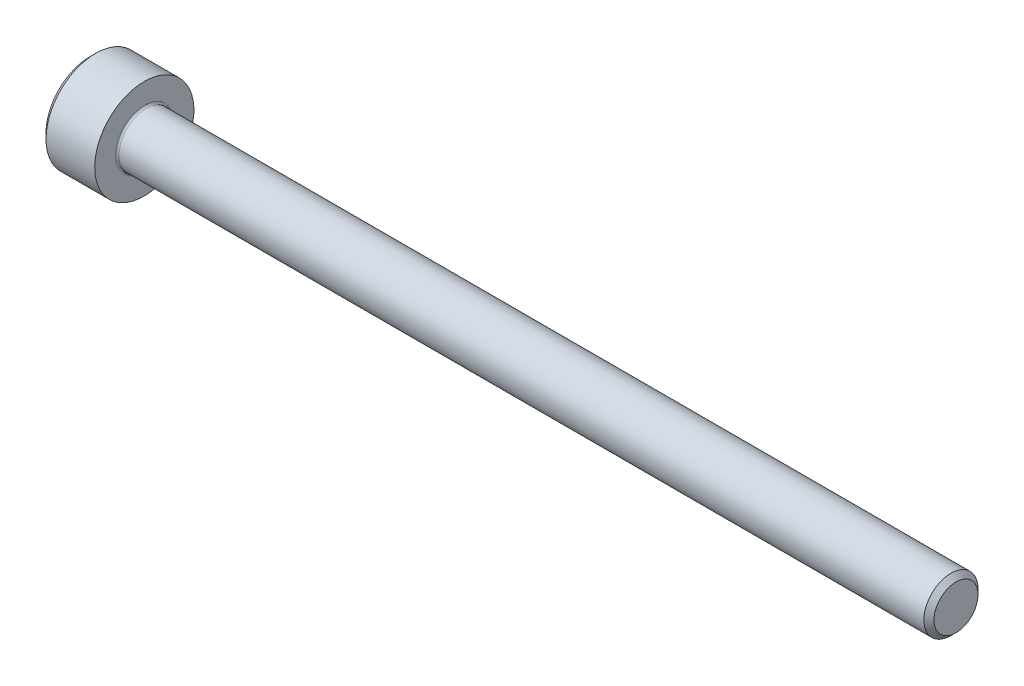
ISO-10303-21;
HEADER;
FILE_DESCRIPTION(('STEP AP214'),'2;1');
FILE_NAME('part.step','',(''),(''),'','','');
FILE_SCHEMA(('AUTOMOTIVE_DESIGN { 1 0 10303 214 1 1 1 1 }'));
ENDSEC;
DATA;
#1=APPLICATION_CONTEXT('core data for automotive mechanical design processes');
#2=APPLICATION_PROTOCOL_DEFINITION('international standard','automotive_design',2000,#1);
#3=PRODUCT_CONTEXT('',#1,'mechanical');
#4=PRODUCT('Part','Part','',(#3));
#5=PRODUCT_RELATED_PRODUCT_CATEGORY('part','',(#4));
#6=PRODUCT_DEFINITION_FORMATION('','',#4);
#7=PRODUCT_DEFINITION_CONTEXT('part definition',#1,'design');
#8=PRODUCT_DEFINITION('design','',#6,#7);
#9=PRODUCT_DEFINITION_SHAPE('','',#8);
#10=(LENGTH_UNIT() NAMED_UNIT(*) SI_UNIT(.MILLI.,.METRE.));
#11=(NAMED_UNIT(*) PLANE_ANGLE_UNIT() SI_UNIT($,.RADIAN.));
#12=(NAMED_UNIT(*) SI_UNIT($,.STERADIAN.) SOLID_ANGLE_UNIT());
#13=UNCERTAINTY_MEASURE_WITH_UNIT(LENGTH_MEASURE(1.E-05),#10,'distance_accuracy_value','');
#14=(GEOMETRIC_REPRESENTATION_CONTEXT(3) GLOBAL_UNCERTAINTY_ASSIGNED_CONTEXT((#13)) GLOBAL_UNIT_ASSIGNED_CONTEXT((#10,
#11,#12)) REPRESENTATION_CONTEXT('',''));
#15=CARTESIAN_POINT('',(0.,0.,0.));
#16=DIRECTION('',(0.,0.,1.));
#17=DIRECTION('',(1.,0.,0.));
#18=AXIS2_PLACEMENT_3D('',#15,#16,#17);
#19=CARTESIAN_POINT('',(0.,0.,0.));
#20=DIRECTION('',(-1.,0.,0.));
#21=DIRECTION('',(0.,0.,1.));
#22=AXIS2_PLACEMENT_3D('',#19,#20,#21);
#23=PLANE('',#22);
#24=DIRECTION('',(0.,-0.499999999999999,0.866025403784439));
#25=VECTOR('',#24,1.);
#26=CARTESIAN_POINT('',(0.,1.47801668912544,0.));
#27=LINE('',#26,#25);
#28=CARTESIAN_POINT('',(0.,1.47801668912544,0.));
#29=VERTEX_POINT('',#28);
#30=CARTESIAN_POINT('',(0.,0.739008344562724,1.28));
#31=VERTEX_POINT('',#30);
#32=EDGE_CURVE('E288',#29,#31,#27,.T.);
#33=ORIENTED_EDGE('',*,*,#32,.T.);
#34=DIRECTION('',(0.,1.,0.));
#35=VECTOR('',#34,1.);
#36=CARTESIAN_POINT('',(0.,-0.739008344562718,1.28));
#37=LINE('',#36,#35);
#38=CARTESIAN_POINT('',(0.,-0.739008344562718,1.28));
#39=VERTEX_POINT('',#38);
#40=EDGE_CURVE('E141',#39,#31,#37,.T.);
#41=ORIENTED_EDGE('',*,*,#40,.F.);
#42=DIRECTION('',(0.,-0.500000000000001,-0.866025403784438));
#43=VECTOR('',#42,1.);
#44=CARTESIAN_POINT('',(0.,-0.739008344562718,1.28));
#45=LINE('',#44,#43);
#46=CARTESIAN_POINT('',(0.,-1.47801668912544,0.));
#47=VERTEX_POINT('',#46);
#48=EDGE_CURVE('E293',#39,#47,#45,.T.);
#49=ORIENTED_EDGE('',*,*,#48,.T.);
#50=DIRECTION('',(0.,0.499999999999998,-0.866025403784439));
#51=VECTOR('',#50,1.);
#52=CARTESIAN_POINT('',(0.,-1.47801668912544,0.));
#53=LINE('',#52,#51);
#54=CARTESIAN_POINT('',(0.,-0.739008344562722,-1.28));
#55=VERTEX_POINT('',#54);
#56=EDGE_CURVE('E297',#47,#55,#53,.T.);
#57=ORIENTED_EDGE('',*,*,#56,.T.);
#58=DIRECTION('',(0.,-1.,0.));
#59=VECTOR('',#58,1.);
#60=CARTESIAN_POINT('',(0.,0.73900834456272,-1.28));
#61=LINE('',#60,#59);
#62=CARTESIAN_POINT('',(0.,0.73900834456272,-1.28));
#63=VERTEX_POINT('',#62);
#64=EDGE_CURVE('E301',#63,#55,#61,.T.);
#65=ORIENTED_EDGE('',*,*,#64,.F.);
#66=DIRECTION('',(0.,-0.500000000000001,-0.866025403784438));
#67=VECTOR('',#66,1.);
#68=CARTESIAN_POINT('',(0.,1.47801668912544,0.));
#69=LINE('',#68,#67);
#70=EDGE_CURVE('E136',#29,#63,#69,.T.);
#71=ORIENTED_EDGE('',*,*,#70,.F.);
#72=EDGE_LOOP('',(#33,#41,#49,#57,#65,#71));
#73=FACE_BOUND('',#72,.T.);
#74=CARTESIAN_POINT('',(0.,0.,0.));
#75=DIRECTION('',(-1.,0.,0.));
#76=DIRECTION('',(0.,0.,1.));
#77=AXIS2_PLACEMENT_3D('',#74,#75,#76);
#78=CIRCLE('',#77,2.45);
#79=CARTESIAN_POINT('',(0.,0.,2.45));
#80=VERTEX_POINT('',#79);
#81=EDGE_CURVE('E174',#80,#80,#78,.T.);
#82=ORIENTED_EDGE('',*,*,#81,.T.);
#83=EDGE_LOOP('',(#82));
#84=FACE_BOUND('',#83,.T.);
#85=ADVANCED_FACE('F42',(#73,#84),#23,.T.);
#86=CARTESIAN_POINT('',(0.,0.,0.));
#87=DIRECTION('',(1.,0.,0.));
#88=DIRECTION('',(0.,0.,-1.));
#89=AXIS2_PLACEMENT_3D('',#86,#87,#88);
#90=CONICAL_SURFACE('',#89,2.45,0.785398163397443);
#91=CARTESIAN_POINT('',(0.300000000000002,0.,0.));
#92=DIRECTION('',(-1.,0.,0.));
#93=DIRECTION('',(0.,0.,1.));
#94=AXIS2_PLACEMENT_3D('',#91,#92,#93);
#95=CIRCLE('',#94,2.75);
#96=CARTESIAN_POINT('',(0.300000000000002,0.,2.75));
#97=VERTEX_POINT('',#96);
#98=EDGE_CURVE('E170',#97,#97,#95,.T.);
#99=ORIENTED_EDGE('',*,*,#98,.T.);
#100=EDGE_LOOP('',(#99));
#101=FACE_BOUND('',#100,.T.);
#102=ORIENTED_EDGE('',*,*,#81,.F.);
#103=EDGE_LOOP('',(#102));
#104=FACE_BOUND('',#103,.T.);
#105=ADVANCED_FACE('F198',(#101,#104),#90,.T.);
#106=CARTESIAN_POINT('',(-31.75,0.,0.));
#107=DIRECTION('',(-1.,0.,0.));
#108=DIRECTION('',(0.,0.,1.));
#109=AXIS2_PLACEMENT_3D('',#106,#107,#108);
#110=CYLINDRICAL_SURFACE('',#109,2.75);
#111=CARTESIAN_POINT('',(3.,0.,0.));
#112=DIRECTION('',(-1.,0.,0.));
#113=DIRECTION('',(0.,0.,1.));
#114=AXIS2_PLACEMENT_3D('',#111,#112,#113);
#115=CIRCLE('',#114,2.75);
#116=CARTESIAN_POINT('',(3.,0.,2.75));
#117=VERTEX_POINT('',#116);
#118=EDGE_CURVE('E166',#117,#117,#115,.T.);
#119=ORIENTED_EDGE('',*,*,#118,.T.);
#120=EDGE_LOOP('',(#119));
#121=FACE_BOUND('',#120,.T.);
#122=ORIENTED_EDGE('',*,*,#98,.F.);
#123=EDGE_LOOP('',(#122));
#124=FACE_BOUND('',#123,.T.);
#125=ADVANCED_FACE('F203',(#121,#124),#110,.T.);
#126=CARTESIAN_POINT('',(3.,2.75,0.));
#127=DIRECTION('',(1.,0.,0.));
#128=DIRECTION('',(0.,0.,-1.));
#129=AXIS2_PLACEMENT_3D('',#126,#127,#128);
#130=PLANE('',#129);
#131=CARTESIAN_POINT('',(3.,0.,0.));
#132=DIRECTION('',(1.,0.,0.));
#133=DIRECTION('',(0.,0.,-1.));
#134=AXIS2_PLACEMENT_3D('',#131,#132,#133);
#135=CIRCLE('',#134,1.6);
#136=CARTESIAN_POINT('',(3.,0.,-1.6));
#137=VERTEX_POINT('',#136);
#138=EDGE_CURVE('E51',#137,#137,#135,.F.);
#139=ORIENTED_EDGE('',*,*,#138,.T.);
#140=EDGE_LOOP('',(#139));
#141=FACE_BOUND('',#140,.T.);
#142=ORIENTED_EDGE('',*,*,#118,.F.);
#143=EDGE_LOOP('',(#142));
#144=FACE_BOUND('',#143,.T.);
#145=ADVANCED_FACE('F182',(#141,#144),#130,.T.);
#146=CARTESIAN_POINT('',(-31.75,0.,0.));
#147=DIRECTION('',(-1.,0.,0.));
#148=DIRECTION('',(0.,0.,1.));
#149=AXIS2_PLACEMENT_3D('',#146,#147,#148);
#150=CYLINDRICAL_SURFACE('',#149,1.5);
#151=CARTESIAN_POINT('',(3.1,0.,0.));
#152=DIRECTION('',(1.,0.,0.));
#153=DIRECTION('',(0.,0.,-1.));
#154=AXIS2_PLACEMENT_3D('',#151,#152,#153);
#155=CIRCLE('',#154,1.5);
#156=CARTESIAN_POINT('',(3.1,0.,-1.5));
#157=VERTEX_POINT('',#156);
#158=EDGE_CURVE('E11',#157,#157,#155,.T.);
#159=ORIENTED_EDGE('',*,*,#158,.T.);
#160=EDGE_LOOP('',(#159));
#161=FACE_BOUND('',#160,.T.);
#162=CARTESIAN_POINT('',(47.7195,0.,0.));
#163=DIRECTION('',(-1.,0.,0.));
#164=DIRECTION('',(0.,0.,1.));
#165=AXIS2_PLACEMENT_3D('',#162,#163,#164);
#166=CIRCLE('',#165,1.5);
#167=CARTESIAN_POINT('',(47.7195,0.,1.5));
#168=VERTEX_POINT('',#167);
#169=EDGE_CURVE('E162',#168,#168,#166,.T.);
#170=ORIENTED_EDGE('',*,*,#169,.T.);
#171=EDGE_LOOP('',(#170));
#172=FACE_BOUND('',#171,.T.);
#173=ADVANCED_FACE('F213',(#161,#172),#150,.T.);
#174=CARTESIAN_POINT('',(48.,0.,0.));
#175=DIRECTION('',(-1.,0.,0.));
#176=DIRECTION('',(0.,0.,1.));
#177=AXIS2_PLACEMENT_3D('',#174,#175,#176);
#178=CONICAL_SURFACE('',#177,1.2195,0.785398163397468);
#179=ORIENTED_EDGE('',*,*,#169,.F.);
#180=EDGE_LOOP('',(#179));
#181=FACE_BOUND('',#180,.T.);
#182=CARTESIAN_POINT('',(48.,0.,0.));
#183=DIRECTION('',(-1.,0.,0.));
#184=DIRECTION('',(0.,0.,1.));
#185=AXIS2_PLACEMENT_3D('',#182,#183,#184);
#186=CIRCLE('',#185,1.2195);
#187=CARTESIAN_POINT('',(48.,0.,1.2195));
#188=VERTEX_POINT('',#187);
#189=EDGE_CURVE('E157',#188,#188,#186,.T.);
#190=ORIENTED_EDGE('',*,*,#189,.T.);
#191=EDGE_LOOP('',(#190));
#192=FACE_BOUND('',#191,.T.);
#193=ADVANCED_FACE('F193',(#181,#192),#178,.T.);
#194=CARTESIAN_POINT('',(48.,1.2195,0.));
#195=DIRECTION('',(1.,0.,0.));
#196=DIRECTION('',(0.,0.,-1.));
#197=AXIS2_PLACEMENT_3D('',#194,#195,#196);
#198=PLANE('',#197);
#199=ORIENTED_EDGE('',*,*,#189,.F.);
#200=EDGE_LOOP('',(#199));
#201=FACE_BOUND('',#200,.T.);
#202=ADVANCED_FACE('F186',(#201),#198,.T.);
#203=CARTESIAN_POINT('',(3.1,0.,0.));
#204=DIRECTION('',(1.,0.,0.));
#205=DIRECTION('',(0.,0.,-1.));
#206=AXIS2_PLACEMENT_3D('',#203,#204,#205);
#207=TOROIDAL_SURFACE('',#206,1.6,0.1);
#208=ORIENTED_EDGE('',*,*,#158,.F.);
#209=EDGE_LOOP('',(#208));
#210=FACE_BOUND('',#209,.T.);
#211=ORIENTED_EDGE('',*,*,#138,.F.);
#212=EDGE_LOOP('',(#211));
#213=FACE_BOUND('',#212,.T.);
#214=ADVANCED_FACE('F44',(#210,#213),#207,.F.);
#215=CARTESIAN_POINT('',(1.3,1.47801668912544,0.));
#216=DIRECTION('',(0.,-0.866025403784439,-0.499999999999999));
#217=DIRECTION('',(0.,0.499999999999999,-0.866025403784439));
#218=AXIS2_PLACEMENT_3D('',#215,#216,#217);
#219=PLANE('',#218);
#220=ORIENTED_EDGE('',*,*,#32,.F.);
#221=DIRECTION('',(-1.,0.,0.));
#222=VECTOR('',#221,1.);
#223=CARTESIAN_POINT('',(1.3,1.47801668912544,0.));
#224=LINE('',#223,#222);
#225=CARTESIAN_POINT('',(1.3,1.47801668912544,0.));
#226=VERTEX_POINT('',#225);
#227=EDGE_CURVE('E274',#226,#29,#224,.T.);
#228=ORIENTED_EDGE('',*,*,#227,.F.);
#229=DIRECTION('',(0.,-0.499999999999999,0.866025403784439));
#230=VECTOR('',#229,1.);
#231=CARTESIAN_POINT('',(1.3,1.47801668912544,0.));
#232=LINE('',#231,#230);
#233=CARTESIAN_POINT('',(1.3,1.10851251684408,0.639999999999999));
#234=VERTEX_POINT('',#233);
#235=EDGE_CURVE('E127',#226,#234,#232,.T.);
#236=ORIENTED_EDGE('',*,*,#235,.T.);
#237=CARTESIAN_POINT('',(1.3,0.739008344562724,1.28));
#238=VERTEX_POINT('',#237);
#239=EDGE_CURVE('E117',#234,#238,#232,.T.);
#240=ORIENTED_EDGE('',*,*,#239,.T.);
#241=DIRECTION('',(-1.,0.,0.));
#242=VECTOR('',#241,1.);
#243=CARTESIAN_POINT('',(1.3,0.739008344562724,1.28));
#244=LINE('',#243,#242);
#245=EDGE_CURVE('E132',#238,#31,#244,.T.);
#246=ORIENTED_EDGE('',*,*,#245,.T.);
#247=EDGE_LOOP('',(#220,#228,#236,#240,#246));
#248=FACE_BOUND('',#247,.T.);
#249=ADVANCED_FACE('F131',(#248),#219,.T.);
#250=CARTESIAN_POINT('',(1.3,-0.739008344562718,1.28));
#251=DIRECTION('',(0.,0.,1.));
#252=DIRECTION('',(0.,-1.,0.));
#253=AXIS2_PLACEMENT_3D('',#250,#251,#252);
#254=PLANE('',#253);
#255=ORIENTED_EDGE('',*,*,#40,.T.);
#256=ORIENTED_EDGE('',*,*,#245,.F.);
#257=DIRECTION('',(0.,1.,0.));
#258=VECTOR('',#257,1.);
#259=CARTESIAN_POINT('',(1.3,-0.739008344562718,1.28));
#260=LINE('',#259,#258);
#261=CARTESIAN_POINT('',(1.3,0.,1.28));
#262=VERTEX_POINT('',#261);
#263=EDGE_CURVE('E114',#262,#238,#260,.T.);
#264=ORIENTED_EDGE('',*,*,#263,.F.);
#265=CARTESIAN_POINT('',(1.3,-0.739008344562718,1.28));
#266=VERTEX_POINT('',#265);
#267=EDGE_CURVE('E126',#266,#262,#260,.T.);
#268=ORIENTED_EDGE('',*,*,#267,.F.);
#269=DIRECTION('',(-1.,0.,0.));
#270=VECTOR('',#269,1.);
#271=CARTESIAN_POINT('',(1.3,-0.739008344562718,1.28));
#272=LINE('',#271,#270);
#273=EDGE_CURVE('E144',#266,#39,#272,.T.);
#274=ORIENTED_EDGE('',*,*,#273,.T.);
#275=EDGE_LOOP('',(#255,#256,#264,#268,#274));
#276=FACE_BOUND('',#275,.T.);
#277=ADVANCED_FACE('F138',(#276),#254,.F.);
#278=CARTESIAN_POINT('',(1.3,-0.739008344562718,1.28));
#279=DIRECTION('',(0.,0.866025403784438,-0.500000000000001));
#280=DIRECTION('',(0.,0.500000000000001,0.866025403784438));
#281=AXIS2_PLACEMENT_3D('',#278,#279,#280);
#282=PLANE('',#281);
#283=ORIENTED_EDGE('',*,*,#48,.F.);
#284=ORIENTED_EDGE('',*,*,#273,.F.);
#285=DIRECTION('',(0.,-0.500000000000001,-0.866025403784438));
#286=VECTOR('',#285,1.);
#287=CARTESIAN_POINT('',(1.3,-0.739008344562718,1.28));
#288=LINE('',#287,#286);
#289=CARTESIAN_POINT('',(1.3,-1.10851251684408,0.640000000000001));
#290=VERTEX_POINT('',#289);
#291=EDGE_CURVE('E336',#266,#290,#288,.T.);
#292=ORIENTED_EDGE('',*,*,#291,.T.);
#293=CARTESIAN_POINT('',(1.3,-1.47801668912544,0.));
#294=VERTEX_POINT('',#293);
#295=EDGE_CURVE('E316',#290,#294,#288,.T.);
#296=ORIENTED_EDGE('',*,*,#295,.T.);
#297=DIRECTION('',(-1.,0.,0.));
#298=VECTOR('',#297,1.);
#299=CARTESIAN_POINT('',(1.3,-1.47801668912544,0.));
#300=LINE('',#299,#298);
#301=EDGE_CURVE('E152',#294,#47,#300,.T.);
#302=ORIENTED_EDGE('',*,*,#301,.T.);
#303=EDGE_LOOP('',(#283,#284,#292,#296,#302));
#304=FACE_BOUND('',#303,.T.);
#305=ADVANCED_FACE('F226',(#304),#282,.T.);
#306=CARTESIAN_POINT('',(1.3,-1.47801668912544,0.));
#307=DIRECTION('',(0.,0.86602540378444,0.499999999999998));
#308=DIRECTION('',(0.,-0.499999999999998,0.86602540378444));
#309=AXIS2_PLACEMENT_3D('',#306,#307,#308);
#310=PLANE('',#309);
#311=ORIENTED_EDGE('',*,*,#56,.F.);
#312=ORIENTED_EDGE('',*,*,#301,.F.);
#313=DIRECTION('',(0.,0.499999999999998,-0.866025403784439));
#314=VECTOR('',#313,1.);
#315=CARTESIAN_POINT('',(1.3,-1.47801668912544,0.));
#316=LINE('',#315,#314);
#317=CARTESIAN_POINT('',(1.3,-1.10851251684408,-0.639999999999997));
#318=VERTEX_POINT('',#317);
#319=EDGE_CURVE('E283',#294,#318,#316,.T.);
#320=ORIENTED_EDGE('',*,*,#319,.T.);
#321=CARTESIAN_POINT('',(1.3,-0.739008344562722,-1.28));
#322=VERTEX_POINT('',#321);
#323=EDGE_CURVE('E334',#318,#322,#316,.T.);
#324=ORIENTED_EDGE('',*,*,#323,.T.);
#325=DIRECTION('',(-1.,0.,0.));
#326=VECTOR('',#325,1.);
#327=CARTESIAN_POINT('',(1.3,-0.739008344562722,-1.28));
#328=LINE('',#327,#326);
#329=EDGE_CURVE('E273',#322,#55,#328,.T.);
#330=ORIENTED_EDGE('',*,*,#329,.T.);
#331=EDGE_LOOP('',(#311,#312,#320,#324,#330));
#332=FACE_BOUND('',#331,.T.);
#333=ADVANCED_FACE('F229',(#332),#310,.T.);
#334=CARTESIAN_POINT('',(1.3,0.73900834456272,-1.28));
#335=DIRECTION('',(0.,0.,-1.));
#336=DIRECTION('',(0.,1.,0.));
#337=AXIS2_PLACEMENT_3D('',#334,#335,#336);
#338=PLANE('',#337);
#339=ORIENTED_EDGE('',*,*,#64,.T.);
#340=ORIENTED_EDGE('',*,*,#329,.F.);
#341=DIRECTION('',(0.,-1.,0.));
#342=VECTOR('',#341,1.);
#343=CARTESIAN_POINT('',(1.3,0.73900834456272,-1.28));
#344=LINE('',#343,#342);
#345=CARTESIAN_POINT('',(1.3,0.,-1.28));
#346=VERTEX_POINT('',#345);
#347=EDGE_CURVE('E277',#346,#322,#344,.T.);
#348=ORIENTED_EDGE('',*,*,#347,.F.);
#349=CARTESIAN_POINT('',(1.3,0.73900834456272,-1.28));
#350=VERTEX_POINT('',#349);
#351=EDGE_CURVE('E58',#350,#346,#344,.T.);
#352=ORIENTED_EDGE('',*,*,#351,.F.);
#353=DIRECTION('',(-1.,0.,0.));
#354=VECTOR('',#353,1.);
#355=CARTESIAN_POINT('',(1.3,0.73900834456272,-1.28));
#356=LINE('',#355,#354);
#357=EDGE_CURVE('E269',#350,#63,#356,.T.);
#358=ORIENTED_EDGE('',*,*,#357,.T.);
#359=EDGE_LOOP('',(#339,#340,#348,#352,#358));
#360=FACE_BOUND('',#359,.T.);
#361=ADVANCED_FACE('F233',(#360),#338,.F.);
#362=CARTESIAN_POINT('',(1.3,1.47801668912544,0.));
#363=DIRECTION('',(0.,0.866025403784438,-0.500000000000001));
#364=DIRECTION('',(0.,0.500000000000001,0.866025403784438));
#365=AXIS2_PLACEMENT_3D('',#362,#363,#364);
#366=PLANE('',#365);
#367=ORIENTED_EDGE('',*,*,#70,.T.);
#368=ORIENTED_EDGE('',*,*,#357,.F.);
#369=DIRECTION('',(0.,-0.500000000000001,-0.866025403784438));
#370=VECTOR('',#369,1.);
#371=CARTESIAN_POINT('',(1.3,1.47801668912544,0.));
#372=LINE('',#371,#370);
#373=CARTESIAN_POINT('',(1.3,1.10851251684408,-0.640000000000002));
#374=VERTEX_POINT('',#373);
#375=EDGE_CURVE('E258',#374,#350,#372,.T.);
#376=ORIENTED_EDGE('',*,*,#375,.F.);
#377=EDGE_CURVE('E265',#226,#374,#372,.T.);
#378=ORIENTED_EDGE('',*,*,#377,.F.);
#379=ORIENTED_EDGE('',*,*,#227,.T.);
#380=EDGE_LOOP('',(#367,#368,#376,#378,#379));
#381=FACE_BOUND('',#380,.T.);
#382=ADVANCED_FACE('F237',(#381),#366,.F.);
#383=CARTESIAN_POINT('',(1.3,2.21702503368816,-1.28));
#384=DIRECTION('',(1.,0.,0.));
#385=DIRECTION('',(0.,0.,-1.));
#386=AXIS2_PLACEMENT_3D('',#383,#384,#385);
#387=PLANE('',#386);
#388=ORIENTED_EDGE('',*,*,#347,.T.);
#389=ORIENTED_EDGE('',*,*,#323,.F.);
#390=CARTESIAN_POINT('',(1.3,0.,0.));
#391=DIRECTION('',(-1.,0.,0.));
#392=DIRECTION('',(0.,0.,1.));
#393=AXIS2_PLACEMENT_3D('',#390,#391,#392);
#394=CIRCLE('',#393,1.28);
#395=EDGE_CURVE('E325',#346,#318,#394,.T.);
#396=ORIENTED_EDGE('',*,*,#395,.F.);
#397=EDGE_LOOP('',(#388,#389,#396));
#398=FACE_BOUND('',#397,.T.);
#399=ADVANCED_FACE('F241',(#398),#387,.F.);
#400=ORIENTED_EDGE('',*,*,#319,.F.);
#401=ORIENTED_EDGE('',*,*,#295,.F.);
#402=EDGE_CURVE('E150',#318,#290,#394,.T.);
#403=ORIENTED_EDGE('',*,*,#402,.F.);
#404=EDGE_LOOP('',(#400,#401,#403));
#405=FACE_BOUND('',#404,.T.);
#406=ADVANCED_FACE('F244',(#405),#387,.F.);
#407=ORIENTED_EDGE('',*,*,#291,.F.);
#408=ORIENTED_EDGE('',*,*,#267,.T.);
#409=EDGE_CURVE('E143',#290,#262,#394,.T.);
#410=ORIENTED_EDGE('',*,*,#409,.F.);
#411=EDGE_LOOP('',(#407,#408,#410));
#412=FACE_BOUND('',#411,.T.);
#413=ADVANCED_FACE('F249',(#412),#387,.F.);
#414=ORIENTED_EDGE('',*,*,#263,.T.);
#415=ORIENTED_EDGE('',*,*,#239,.F.);
#416=EDGE_CURVE('E120',#262,#234,#394,.T.);
#417=ORIENTED_EDGE('',*,*,#416,.F.);
#418=EDGE_LOOP('',(#414,#415,#417));
#419=FACE_BOUND('',#418,.T.);
#420=ADVANCED_FACE('F116',(#419),#387,.F.);
#421=ORIENTED_EDGE('',*,*,#235,.F.);
#422=ORIENTED_EDGE('',*,*,#377,.T.);
#423=EDGE_CURVE('E158',#234,#374,#394,.T.);
#424=ORIENTED_EDGE('',*,*,#423,.F.);
#425=EDGE_LOOP('',(#421,#422,#424));
#426=FACE_BOUND('',#425,.T.);
#427=ADVANCED_FACE('F252',(#426),#387,.F.);
#428=ORIENTED_EDGE('',*,*,#375,.T.);
#429=ORIENTED_EDGE('',*,*,#351,.T.);
#430=EDGE_CURVE('E261',#374,#346,#394,.T.);
#431=ORIENTED_EDGE('',*,*,#430,.F.);
#432=EDGE_LOOP('',(#428,#429,#431));
#433=FACE_BOUND('',#432,.T.);
#434=ADVANCED_FACE('F222',(#433),#387,.F.);
#435=CARTESIAN_POINT('',(1.3,0.,0.));
#436=DIRECTION('',(-1.,0.,0.));
#437=DIRECTION('',(0.,0.,1.));
#438=AXIS2_PLACEMENT_3D('',#435,#436,#437);
#439=CONICAL_SURFACE('',#438,1.28,1.0471975511966);
#440=CARTESIAN_POINT('',(2.03900834456273,0.,0.));
#441=VERTEX_POINT('',#440);
#442=VERTEX_LOOP('',#441);
#443=FACE_BOUND('',#442,.T.);
#444=ORIENTED_EDGE('',*,*,#416,.T.);
#445=ORIENTED_EDGE('',*,*,#423,.T.);
#446=ORIENTED_EDGE('',*,*,#430,.T.);
#447=ORIENTED_EDGE('',*,*,#395,.T.);
#448=ORIENTED_EDGE('',*,*,#402,.T.);
#449=ORIENTED_EDGE('',*,*,#409,.T.);
#450=EDGE_LOOP('',(#444,#445,#446,#447,#448,#449));
#451=FACE_BOUND('',#450,.T.);
#452=ADVANCED_FACE('F220',(#443,#451),#439,.F.);
#453=CLOSED_SHELL('',(#85,#105,#125,#145,#173,#193,#202,#214,#249,#277,#305,#333,#361,#382,#399,
#406,#413,#420,#427,#434,#452));
#454=MANIFOLD_SOLID_BREP('B2',#453);
#455=ADVANCED_BREP_SHAPE_REPRESENTATION('',(#18,#454),#14);
#456=SHAPE_DEFINITION_REPRESENTATION(#9,#455);
ENDSEC;
END-ISO-10303-21;
